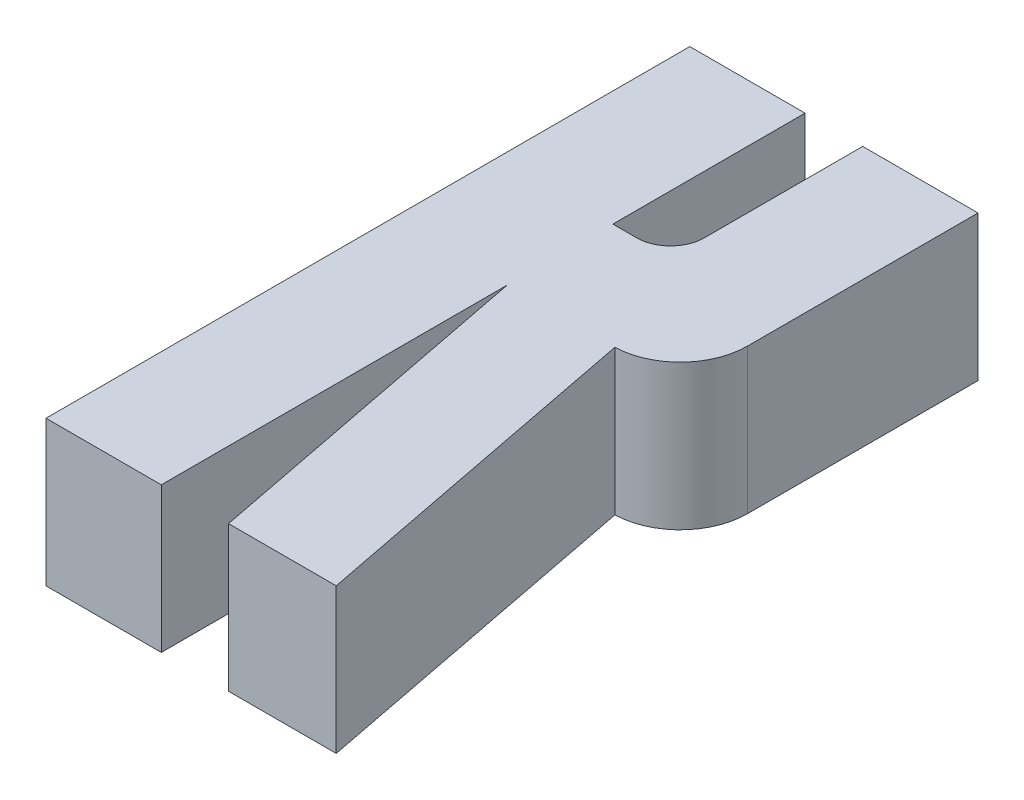
ISO-10303-21;
HEADER;
FILE_DESCRIPTION(('STEP AP214'),'2;1');
FILE_NAME('part.step','',(''),(''),'','','');
FILE_SCHEMA(('AUTOMOTIVE_DESIGN { 1 0 10303 214 1 1 1 1 }'));
ENDSEC;
DATA;
#1=APPLICATION_CONTEXT('core data for automotive mechanical design processes');
#2=APPLICATION_PROTOCOL_DEFINITION('international standard','automotive_design',2000,#1);
#3=PRODUCT_CONTEXT('',#1,'mechanical');
#4=PRODUCT('Part','Part','',(#3));
#5=PRODUCT_RELATED_PRODUCT_CATEGORY('part','',(#4));
#6=PRODUCT_DEFINITION_FORMATION('','',#4);
#7=PRODUCT_DEFINITION_CONTEXT('part definition',#1,'design');
#8=PRODUCT_DEFINITION('design','',#6,#7);
#9=PRODUCT_DEFINITION_SHAPE('','',#8);
#10=(LENGTH_UNIT() NAMED_UNIT(*) SI_UNIT(.MILLI.,.METRE.));
#11=(NAMED_UNIT(*) PLANE_ANGLE_UNIT() SI_UNIT($,.RADIAN.));
#12=(NAMED_UNIT(*) SI_UNIT($,.STERADIAN.) SOLID_ANGLE_UNIT());
#13=UNCERTAINTY_MEASURE_WITH_UNIT(LENGTH_MEASURE(1.E-05),#10,'distance_accuracy_value','');
#14=(GEOMETRIC_REPRESENTATION_CONTEXT(3) GLOBAL_UNCERTAINTY_ASSIGNED_CONTEXT((#13)) GLOBAL_UNIT_ASSIGNED_CONTEXT((#10,
#11,#12)) REPRESENTATION_CONTEXT('',''));
#15=CARTESIAN_POINT('',(0.,0.,0.));
#16=DIRECTION('',(0.,0.,1.));
#17=DIRECTION('',(1.,0.,0.));
#18=AXIS2_PLACEMENT_3D('',#15,#16,#17);
#19=CARTESIAN_POINT('',(1726.18487269122,-302.250162855083,2545.6184611197));
#20=DIRECTION('',(0.,-1.,0.));
#21=DIRECTION('',(0.,0.,-1.));
#22=AXIS2_PLACEMENT_3D('',#19,#20,#21);
#23=PLANE('',#22);
#24=DIRECTION('',(0.,0.,1.));
#25=VECTOR('',#24,1.);
#26=CARTESIAN_POINT('',(1690.03612397511,-302.250162855083,2507.8980276768));
#27=LINE('',#26,#25);
#28=CARTESIAN_POINT('',(1690.03612397511,-302.250162855083,2507.8980276768));
#29=VERTEX_POINT('',#28);
#30=CARTESIAN_POINT('',(1690.03612397511,-302.250162855083,2613.20090437155));
#31=VERTEX_POINT('',#30);
#32=EDGE_CURVE('E11',#29,#31,#27,.T.);
#33=ORIENTED_EDGE('',*,*,#32,.F.);
#34=DIRECTION('',(1.,0.,0.));
#35=VECTOR('',#34,1.);
#36=CARTESIAN_POINT('',(1690.03612397511,-302.250162855083,2507.8980276768));
#37=LINE('',#36,#35);
#38=CARTESIAN_POINT('',(1708.89634069656,-302.250162855083,2507.8980276768));
#39=VERTEX_POINT('',#38);
#40=EDGE_CURVE('E210',#29,#39,#37,.T.);
#41=ORIENTED_EDGE('',*,*,#40,.T.);
#42=DIRECTION('',(0.,0.,-1.));
#43=VECTOR('',#42,1.);
#44=CARTESIAN_POINT('',(1708.89634069656,-302.250162855083,2539.33172221255));
#45=LINE('',#44,#43);
#46=CARTESIAN_POINT('',(1708.89634069656,-302.250162855083,2539.33172221255));
#47=VERTEX_POINT('',#46);
#48=EDGE_CURVE('E126',#47,#39,#45,.T.);
#49=ORIENTED_EDGE('',*,*,#48,.F.);
#50=DIRECTION('',(1.,0.,0.));
#51=VECTOR('',#50,1.);
#52=CARTESIAN_POINT('',(1708.89634069656,-302.250162855083,2539.33172221255));
#53=LINE('',#52,#51);
#54=CARTESIAN_POINT('',(1712.82555251353,-302.250162855083,2539.33172221255));
#55=VERTEX_POINT('',#54);
#56=EDGE_CURVE('E213',#47,#55,#53,.T.);
#57=ORIENTED_EDGE('',*,*,#56,.T.);
#58=CARTESIAN_POINT('',(1712.82555251353,-302.250162855083,2533.83082566879));
#59=DIRECTION('',(0.,-1.,0.));
#60=DIRECTION('',(1.,0.,0.));
#61=AXIS2_PLACEMENT_3D('',#58,#59,#60);
#62=CIRCLE('',#61,5.50089654375593);
#63=CARTESIAN_POINT('',(1718.32644905729,-302.250162855083,2533.83082566879));
#64=VERTEX_POINT('',#63);
#65=EDGE_CURVE('E122',#64,#55,#62,.T.);
#66=ORIENTED_EDGE('',*,*,#65,.F.);
#67=DIRECTION('',(0.,0.,-1.));
#68=VECTOR('',#67,1.);
#69=CARTESIAN_POINT('',(1718.32644905729,-302.250162855083,2533.83082566879));
#70=LINE('',#69,#68);
#71=CARTESIAN_POINT('',(1718.32644905729,-302.250162855083,2507.8980276768));
#72=VERTEX_POINT('',#71);
#73=EDGE_CURVE('E219',#64,#72,#70,.T.);
#74=ORIENTED_EDGE('',*,*,#73,.T.);
#75=DIRECTION('',(1.,0.,0.));
#76=VECTOR('',#75,1.);
#77=CARTESIAN_POINT('',(1718.32644905729,-302.250162855083,2507.8980276768));
#78=LINE('',#77,#76);
#79=CARTESIAN_POINT('',(1737.18666577874,-302.250162855083,2507.8980276768));
#80=VERTEX_POINT('',#79);
#81=EDGE_CURVE('E144',#72,#80,#78,.T.);
#82=ORIENTED_EDGE('',*,*,#81,.T.);
#83=DIRECTION('',(0.,0.,-1.));
#84=VECTOR('',#83,1.);
#85=CARTESIAN_POINT('',(1737.18666577874,-302.250162855083,2545.6184611197));
#86=LINE('',#85,#84);
#87=CARTESIAN_POINT('',(1737.18666577874,-302.250162855083,2545.6184611197));
#88=VERTEX_POINT('',#87);
#89=EDGE_CURVE('E115',#88,#80,#86,.T.);
#90=ORIENTED_EDGE('',*,*,#89,.F.);
#91=CARTESIAN_POINT('',(1726.18487269122,-302.250162855083,2545.6184611197));
#92=DIRECTION('',(0.,-1.,0.));
#93=DIRECTION('',(1.,0.,0.));
#94=AXIS2_PLACEMENT_3D('',#91,#92,#93);
#95=CIRCLE('',#94,11.0017930875118);
#96=CARTESIAN_POINT('',(1726.50753694261,-302.250162855083,2556.61552158699));
#97=VERTEX_POINT('',#96);
#98=EDGE_CURVE('E140',#88,#97,#95,.T.);
#99=ORIENTED_EDGE('',*,*,#98,.T.);
#100=DIRECTION('',(0.190808995376545,0.,0.981627183447664));
#101=VECTOR('',#100,1.);
#102=CARTESIAN_POINT('',(1726.50753694261,-302.250162855083,2556.61552158699));
#103=LINE('',#102,#101);
#104=CARTESIAN_POINT('',(1737.50662114095,-302.250162855083,2613.20090437155));
#105=VERTEX_POINT('',#104);
#106=EDGE_CURVE('E134',#97,#105,#103,.T.);
#107=ORIENTED_EDGE('',*,*,#106,.T.);
#108=DIRECTION('',(1.,0.,0.));
#109=VECTOR('',#108,1.);
#110=CARTESIAN_POINT('',(1719.89450496672,-302.250162855083,2613.20090437155));
#111=LINE('',#110,#109);
#112=CARTESIAN_POINT('',(1719.89450496672,-302.250162855083,2613.20090437155));
#113=VERTEX_POINT('',#112);
#114=EDGE_CURVE('E108',#113,#105,#111,.T.);
#115=ORIENTED_EDGE('',*,*,#114,.F.);
#116=DIRECTION('',(0.190808995376545,0.,0.981627183447664));
#117=VECTOR('',#116,1.);
#118=CARTESIAN_POINT('',(1708.89634069656,-302.250162855083,2556.62025420721));
#119=LINE('',#118,#117);
#120=CARTESIAN_POINT('',(1708.89634069656,-302.250162855083,2556.62025420721));
#121=VERTEX_POINT('',#120);
#122=EDGE_CURVE('E89',#121,#113,#119,.T.);
#123=ORIENTED_EDGE('',*,*,#122,.F.);
#124=DIRECTION('',(0.,0.,-1.));
#125=VECTOR('',#124,1.);
#126=CARTESIAN_POINT('',(1708.89634069656,-302.250162855083,2613.20090437155));
#127=LINE('',#126,#125);
#128=CARTESIAN_POINT('',(1708.89634069656,-302.250162855083,2613.20090437155));
#129=VERTEX_POINT('',#128);
#130=EDGE_CURVE('E81',#129,#121,#127,.T.);
#131=ORIENTED_EDGE('',*,*,#130,.F.);
#132=DIRECTION('',(1.,0.,0.));
#133=VECTOR('',#132,1.);
#134=CARTESIAN_POINT('',(1690.03612397511,-302.250162855083,2613.20090437155));
#135=LINE('',#134,#133);
#136=EDGE_CURVE('E92',#31,#129,#135,.T.);
#137=ORIENTED_EDGE('',*,*,#136,.F.);
#138=EDGE_LOOP('',(#33,#41,#49,#57,#66,#74,#82,#90,#99,#107,#115,#123,#131,#137));
#139=FACE_BOUND('',#138,.T.);
#140=ADVANCED_FACE('F16',(#139),#23,.T.);
#141=CARTESIAN_POINT('',(1690.03612397511,-282.250162855083,2507.8980276768));
#142=DIRECTION('',(0.,0.,-1.));
#143=DIRECTION('',(-1.,0.,0.));
#144=AXIS2_PLACEMENT_3D('',#141,#142,#143);
#145=PLANE('',#144);
#146=DIRECTION('',(0.,-1.,0.));
#147=VECTOR('',#146,1.);
#148=CARTESIAN_POINT('',(1690.03612397511,-282.250162855083,2507.8980276768));
#149=LINE('',#148,#147);
#150=CARTESIAN_POINT('',(1690.03612397511,-278.499891429945,2507.8980276768));
#151=VERTEX_POINT('',#150);
#152=EDGE_CURVE('E25',#151,#29,#149,.T.);
#153=ORIENTED_EDGE('',*,*,#152,.F.);
#154=DIRECTION('',(1.,0.,0.));
#155=VECTOR('',#154,1.);
#156=CARTESIAN_POINT('',(1690.03612397511,-278.499891429945,2507.8980276768));
#157=LINE('',#156,#155);
#158=CARTESIAN_POINT('',(1708.89634069656,-278.499891429945,2507.8980276768));
#159=VERTEX_POINT('',#158);
#160=EDGE_CURVE('E239',#151,#159,#157,.T.);
#161=ORIENTED_EDGE('',*,*,#160,.T.);
#162=DIRECTION('',(0.,-1.,0.));
#163=VECTOR('',#162,1.);
#164=CARTESIAN_POINT('',(1708.89634069656,-282.250162855083,2507.8980276768));
#165=LINE('',#164,#163);
#166=EDGE_CURVE('E19',#159,#39,#165,.T.);
#167=ORIENTED_EDGE('',*,*,#166,.T.);
#168=ORIENTED_EDGE('',*,*,#40,.F.);
#169=EDGE_LOOP('',(#153,#161,#167,#168));
#170=FACE_BOUND('',#169,.T.);
#171=ADVANCED_FACE('F263',(#170),#145,.T.);
#172=CARTESIAN_POINT('',(1708.89634069656,-282.250162855083,2539.33172221255));
#173=DIRECTION('',(-1.,0.,0.));
#174=DIRECTION('',(0.,0.,1.));
#175=AXIS2_PLACEMENT_3D('',#172,#173,#174);
#176=PLANE('',#175);
#177=ORIENTED_EDGE('',*,*,#166,.F.);
#178=DIRECTION('',(0.,0.,1.));
#179=VECTOR('',#178,1.);
#180=CARTESIAN_POINT('',(1708.89634069656,-278.499891429945,2507.8980276768));
#181=LINE('',#180,#179);
#182=CARTESIAN_POINT('',(1708.89634069656,-278.499891429945,2539.33172221255));
#183=VERTEX_POINT('',#182);
#184=EDGE_CURVE('E237',#159,#183,#181,.T.);
#185=ORIENTED_EDGE('',*,*,#184,.T.);
#186=DIRECTION('',(0.,-1.,0.));
#187=VECTOR('',#186,1.);
#188=CARTESIAN_POINT('',(1708.89634069656,-282.250162855083,2539.33172221255));
#189=LINE('',#188,#187);
#190=EDGE_CURVE('E127',#183,#47,#189,.T.);
#191=ORIENTED_EDGE('',*,*,#190,.T.);
#192=ORIENTED_EDGE('',*,*,#48,.T.);
#193=EDGE_LOOP('',(#177,#185,#191,#192));
#194=FACE_BOUND('',#193,.T.);
#195=ADVANCED_FACE('F265',(#194),#176,.F.);
#196=CARTESIAN_POINT('',(1708.89634069656,-282.250162855083,2539.33172221255));
#197=DIRECTION('',(0.,0.,-1.));
#198=DIRECTION('',(-1.,0.,0.));
#199=AXIS2_PLACEMENT_3D('',#196,#197,#198);
#200=PLANE('',#199);
#201=ORIENTED_EDGE('',*,*,#190,.F.);
#202=DIRECTION('',(1.,0.,0.));
#203=VECTOR('',#202,1.);
#204=CARTESIAN_POINT('',(1708.89634069656,-278.499891429945,2539.33172221255));
#205=LINE('',#204,#203);
#206=CARTESIAN_POINT('',(1712.82555251353,-278.499891429945,2539.33172221255));
#207=VERTEX_POINT('',#206);
#208=EDGE_CURVE('E232',#183,#207,#205,.T.);
#209=ORIENTED_EDGE('',*,*,#208,.T.);
#210=DIRECTION('',(0.,-1.,0.));
#211=VECTOR('',#210,1.);
#212=CARTESIAN_POINT('',(1712.82555251353,-282.250162855083,2539.33172221255));
#213=LINE('',#212,#211);
#214=EDGE_CURVE('E125',#207,#55,#213,.T.);
#215=ORIENTED_EDGE('',*,*,#214,.T.);
#216=ORIENTED_EDGE('',*,*,#56,.F.);
#217=EDGE_LOOP('',(#201,#209,#215,#216));
#218=FACE_BOUND('',#217,.T.);
#219=ADVANCED_FACE('F268',(#218),#200,.T.);
#220=CARTESIAN_POINT('',(1712.82555251353,-282.250162855083,2533.83082566879));
#221=DIRECTION('',(0.,-1.,0.));
#222=DIRECTION('',(0.,0.,-1.));
#223=AXIS2_PLACEMENT_3D('',#220,#221,#222);
#224=CYLINDRICAL_SURFACE('',#223,5.50089654375593);
#225=ORIENTED_EDGE('',*,*,#214,.F.);
#226=CARTESIAN_POINT('',(1712.82555251353,-278.499891429953,2533.83082566879));
#227=DIRECTION('',(0.,1.,0.));
#228=DIRECTION('',(0.,0.,-1.));
#229=AXIS2_PLACEMENT_3D('',#226,#227,#228);
#230=CIRCLE('',#229,5.50089654375593);
#231=CARTESIAN_POINT('',(1718.32644905729,-278.499891429953,2533.83082566879));
#232=VERTEX_POINT('',#231);
#233=EDGE_CURVE('E231',#207,#232,#230,.T.);
#234=ORIENTED_EDGE('',*,*,#233,.T.);
#235=DIRECTION('',(0.,-1.,0.));
#236=VECTOR('',#235,1.);
#237=CARTESIAN_POINT('',(1718.32644905729,-282.250162855083,2533.83082566879));
#238=LINE('',#237,#236);
#239=EDGE_CURVE('E123',#232,#64,#238,.T.);
#240=ORIENTED_EDGE('',*,*,#239,.T.);
#241=ORIENTED_EDGE('',*,*,#65,.T.);
#242=EDGE_LOOP('',(#225,#234,#240,#241));
#243=FACE_BOUND('',#242,.T.);
#244=ADVANCED_FACE('F270',(#243),#224,.F.);
#245=CARTESIAN_POINT('',(1718.32644905729,-282.250162855083,2533.83082566879));
#246=DIRECTION('',(-1.,0.,0.));
#247=DIRECTION('',(0.,0.,1.));
#248=AXIS2_PLACEMENT_3D('',#245,#246,#247);
#249=PLANE('',#248);
#250=ORIENTED_EDGE('',*,*,#239,.F.);
#251=DIRECTION('',(0.,0.,-1.));
#252=VECTOR('',#251,1.);
#253=CARTESIAN_POINT('',(1718.32644905729,-278.499891429945,2533.83082566879));
#254=LINE('',#253,#252);
#255=CARTESIAN_POINT('',(1718.32644905729,-278.499891429945,2507.8980276768));
#256=VERTEX_POINT('',#255);
#257=EDGE_CURVE('E204',#232,#256,#254,.T.);
#258=ORIENTED_EDGE('',*,*,#257,.T.);
#259=DIRECTION('',(0.,-1.,0.));
#260=VECTOR('',#259,1.);
#261=CARTESIAN_POINT('',(1718.32644905729,-282.250162855083,2507.8980276768));
#262=LINE('',#261,#260);
#263=EDGE_CURVE('E120',#256,#72,#262,.T.);
#264=ORIENTED_EDGE('',*,*,#263,.T.);
#265=ORIENTED_EDGE('',*,*,#73,.F.);
#266=EDGE_LOOP('',(#250,#258,#264,#265));
#267=FACE_BOUND('',#266,.T.);
#268=ADVANCED_FACE('F228',(#267),#249,.T.);
#269=CARTESIAN_POINT('',(1718.32644905729,-282.250162855083,2507.8980276768));
#270=DIRECTION('',(0.,0.,-1.));
#271=DIRECTION('',(-1.,0.,0.));
#272=AXIS2_PLACEMENT_3D('',#269,#270,#271);
#273=PLANE('',#272);
#274=ORIENTED_EDGE('',*,*,#263,.F.);
#275=DIRECTION('',(1.,0.,0.));
#276=VECTOR('',#275,1.);
#277=CARTESIAN_POINT('',(1718.32644905729,-278.499891429945,2507.8980276768));
#278=LINE('',#277,#276);
#279=CARTESIAN_POINT('',(1737.18666577874,-278.499891429945,2507.8980276768));
#280=VERTEX_POINT('',#279);
#281=EDGE_CURVE('E200',#256,#280,#278,.T.);
#282=ORIENTED_EDGE('',*,*,#281,.T.);
#283=DIRECTION('',(0.,-1.,0.));
#284=VECTOR('',#283,1.);
#285=CARTESIAN_POINT('',(1737.18666577874,-282.250162855083,2507.8980276768));
#286=LINE('',#285,#284);
#287=EDGE_CURVE('E118',#280,#80,#286,.T.);
#288=ORIENTED_EDGE('',*,*,#287,.T.);
#289=ORIENTED_EDGE('',*,*,#81,.F.);
#290=EDGE_LOOP('',(#274,#282,#288,#289));
#291=FACE_BOUND('',#290,.T.);
#292=ADVANCED_FACE('F201',(#291),#273,.T.);
#293=CARTESIAN_POINT('',(1737.18666577874,-282.250162855083,2545.6184611197));
#294=DIRECTION('',(-1.,0.,0.));
#295=DIRECTION('',(0.,0.,1.));
#296=AXIS2_PLACEMENT_3D('',#293,#294,#295);
#297=PLANE('',#296);
#298=ORIENTED_EDGE('',*,*,#287,.F.);
#299=DIRECTION('',(0.,0.,1.));
#300=VECTOR('',#299,1.);
#301=CARTESIAN_POINT('',(1737.18666577874,-278.499891429945,2507.8980276768));
#302=LINE('',#301,#300);
#303=CARTESIAN_POINT('',(1737.18666577874,-278.499891429945,2545.6184611197));
#304=VERTEX_POINT('',#303);
#305=EDGE_CURVE('E195',#280,#304,#302,.T.);
#306=ORIENTED_EDGE('',*,*,#305,.T.);
#307=DIRECTION('',(0.,-1.,0.));
#308=VECTOR('',#307,1.);
#309=CARTESIAN_POINT('',(1737.18666577874,-282.250162855083,2545.6184611197));
#310=LINE('',#309,#308);
#311=EDGE_CURVE('E116',#304,#88,#310,.T.);
#312=ORIENTED_EDGE('',*,*,#311,.T.);
#313=ORIENTED_EDGE('',*,*,#89,.T.);
#314=EDGE_LOOP('',(#298,#306,#312,#313));
#315=FACE_BOUND('',#314,.T.);
#316=ADVANCED_FACE('F192',(#315),#297,.F.);
#317=CARTESIAN_POINT('',(1726.18487269122,-282.250162855083,2545.6184611197));
#318=DIRECTION('',(0.,-1.,0.));
#319=DIRECTION('',(0.,0.,-1.));
#320=AXIS2_PLACEMENT_3D('',#317,#318,#319);
#321=CYLINDRICAL_SURFACE('',#320,11.0017930875118);
#322=ORIENTED_EDGE('',*,*,#311,.F.);
#323=CARTESIAN_POINT('',(1726.18487269122,-278.499891429945,2545.6184611197));
#324=DIRECTION('',(0.,-1.,0.));
#325=DIRECTION('',(0.,0.,-1.));
#326=AXIS2_PLACEMENT_3D('',#323,#324,#325);
#327=CIRCLE('',#326,11.0017930875118);
#328=CARTESIAN_POINT('',(1726.50753694261,-278.499891429945,2556.61552158699));
#329=VERTEX_POINT('',#328);
#330=EDGE_CURVE('E209',#304,#329,#327,.T.);
#331=ORIENTED_EDGE('',*,*,#330,.T.);
#332=DIRECTION('',(0.,-1.,0.));
#333=VECTOR('',#332,1.);
#334=CARTESIAN_POINT('',(1726.50753694261,-282.250162855083,2556.61552158699));
#335=LINE('',#334,#333);
#336=EDGE_CURVE('E113',#329,#97,#335,.T.);
#337=ORIENTED_EDGE('',*,*,#336,.T.);
#338=ORIENTED_EDGE('',*,*,#98,.F.);
#339=EDGE_LOOP('',(#322,#331,#337,#338));
#340=FACE_BOUND('',#339,.T.);
#341=ADVANCED_FACE('F253',(#340),#321,.T.);
#342=CARTESIAN_POINT('',(1726.50753694261,-282.250162855083,2556.61552158699));
#343=DIRECTION('',(0.981627183447664,0.,-0.190808995376545));
#344=DIRECTION('',(-0.190808995376545,0.,-0.981627183447664));
#345=AXIS2_PLACEMENT_3D('',#342,#343,#344);
#346=PLANE('',#345);
#347=ORIENTED_EDGE('',*,*,#336,.F.);
#348=DIRECTION('',(0.190808995376548,0.,0.981627183447663));
#349=VECTOR('',#348,1.);
#350=CARTESIAN_POINT('',(1726.50753694261,-278.499891429945,2556.61552158699));
#351=LINE('',#350,#349);
#352=CARTESIAN_POINT('',(1737.50662114095,-278.499891429946,2613.20090437155));
#353=VERTEX_POINT('',#352);
#354=EDGE_CURVE('E248',#329,#353,#351,.T.);
#355=ORIENTED_EDGE('',*,*,#354,.T.);
#356=DIRECTION('',(0.,-1.,0.));
#357=VECTOR('',#356,1.);
#358=CARTESIAN_POINT('',(1737.50662114095,-282.250162855083,2613.20090437155));
#359=LINE('',#358,#357);
#360=EDGE_CURVE('E111',#353,#105,#359,.T.);
#361=ORIENTED_EDGE('',*,*,#360,.T.);
#362=ORIENTED_EDGE('',*,*,#106,.F.);
#363=EDGE_LOOP('',(#347,#355,#361,#362));
#364=FACE_BOUND('',#363,.T.);
#365=ADVANCED_FACE('F258',(#364),#346,.T.);
#366=CARTESIAN_POINT('',(1719.89450496672,-282.250162855083,2613.20090437155));
#367=DIRECTION('',(0.,0.,-1.));
#368=DIRECTION('',(-1.,0.,0.));
#369=AXIS2_PLACEMENT_3D('',#366,#367,#368);
#370=PLANE('',#369);
#371=ORIENTED_EDGE('',*,*,#360,.F.);
#372=DIRECTION('',(-1.,0.,0.));
#373=VECTOR('',#372,1.);
#374=CARTESIAN_POINT('',(1737.50662114095,-278.499891429946,2613.20090437155));
#375=LINE('',#374,#373);
#376=CARTESIAN_POINT('',(1719.89450496672,-278.499891429946,2613.20090437155));
#377=VERTEX_POINT('',#376);
#378=EDGE_CURVE('E157',#353,#377,#375,.T.);
#379=ORIENTED_EDGE('',*,*,#378,.T.);
#380=DIRECTION('',(0.,-1.,0.));
#381=VECTOR('',#380,1.);
#382=CARTESIAN_POINT('',(1719.89450496672,-282.250162855083,2613.20090437155));
#383=LINE('',#382,#381);
#384=EDGE_CURVE('E109',#377,#113,#383,.T.);
#385=ORIENTED_EDGE('',*,*,#384,.T.);
#386=ORIENTED_EDGE('',*,*,#114,.T.);
#387=EDGE_LOOP('',(#371,#379,#385,#386));
#388=FACE_BOUND('',#387,.T.);
#389=ADVANCED_FACE('F150',(#388),#370,.F.);
#390=CARTESIAN_POINT('',(1708.89634069656,-282.250162855083,2556.62025420721));
#391=DIRECTION('',(0.981627183447664,0.,-0.190808995376545));
#392=DIRECTION('',(-0.190808995376545,0.,-0.981627183447664));
#393=AXIS2_PLACEMENT_3D('',#390,#391,#392);
#394=PLANE('',#393);
#395=ORIENTED_EDGE('',*,*,#384,.F.);
#396=DIRECTION('',(-0.190808995376545,0.,-0.981627183447664));
#397=VECTOR('',#396,1.);
#398=CARTESIAN_POINT('',(1719.89450496672,-278.499891429946,2613.20090437155));
#399=LINE('',#398,#397);
#400=CARTESIAN_POINT('',(1708.89634069656,-278.499891429945,2556.62025420721));
#401=VERTEX_POINT('',#400);
#402=EDGE_CURVE('E163',#377,#401,#399,.T.);
#403=ORIENTED_EDGE('',*,*,#402,.T.);
#404=DIRECTION('',(0.,-1.,0.));
#405=VECTOR('',#404,1.);
#406=CARTESIAN_POINT('',(1708.89634069656,-282.250162855083,2556.62025420721));
#407=LINE('',#406,#405);
#408=EDGE_CURVE('E106',#401,#121,#407,.T.);
#409=ORIENTED_EDGE('',*,*,#408,.T.);
#410=ORIENTED_EDGE('',*,*,#122,.T.);
#411=EDGE_LOOP('',(#395,#403,#409,#410));
#412=FACE_BOUND('',#411,.T.);
#413=ADVANCED_FACE('F161',(#412),#394,.F.);
#414=CARTESIAN_POINT('',(1708.89634069656,-282.250162855083,2613.20090437155));
#415=DIRECTION('',(-1.,0.,0.));
#416=DIRECTION('',(0.,0.,1.));
#417=AXIS2_PLACEMENT_3D('',#414,#415,#416);
#418=PLANE('',#417);
#419=ORIENTED_EDGE('',*,*,#408,.F.);
#420=DIRECTION('',(0.,0.,1.));
#421=VECTOR('',#420,1.);
#422=CARTESIAN_POINT('',(1708.89634069656,-278.499891429946,2556.62025420721));
#423=LINE('',#422,#421);
#424=CARTESIAN_POINT('',(1708.89634069656,-278.499891429946,2613.20090437155));
#425=VERTEX_POINT('',#424);
#426=EDGE_CURVE('E85',#401,#425,#423,.T.);
#427=ORIENTED_EDGE('',*,*,#426,.T.);
#428=DIRECTION('',(0.,-1.,0.));
#429=VECTOR('',#428,1.);
#430=CARTESIAN_POINT('',(1708.89634069656,-282.250162855083,2613.20090437155));
#431=LINE('',#430,#429);
#432=EDGE_CURVE('E76',#425,#129,#431,.T.);
#433=ORIENTED_EDGE('',*,*,#432,.T.);
#434=ORIENTED_EDGE('',*,*,#130,.T.);
#435=EDGE_LOOP('',(#419,#427,#433,#434));
#436=FACE_BOUND('',#435,.T.);
#437=ADVANCED_FACE('F79',(#436),#418,.F.);
#438=CARTESIAN_POINT('',(1690.03612397511,-282.250162855083,2613.20090437155));
#439=DIRECTION('',(0.,0.,-1.));
#440=DIRECTION('',(-1.,0.,0.));
#441=AXIS2_PLACEMENT_3D('',#438,#439,#440);
#442=PLANE('',#441);
#443=ORIENTED_EDGE('',*,*,#432,.F.);
#444=DIRECTION('',(-1.,0.,0.));
#445=VECTOR('',#444,1.);
#446=CARTESIAN_POINT('',(1708.89634069656,-278.499891429946,2613.20090437155));
#447=LINE('',#446,#445);
#448=CARTESIAN_POINT('',(1690.03612397511,-278.499891429946,2613.20090437155));
#449=VERTEX_POINT('',#448);
#450=EDGE_CURVE('E243',#425,#449,#447,.T.);
#451=ORIENTED_EDGE('',*,*,#450,.T.);
#452=DIRECTION('',(0.,-1.,0.));
#453=VECTOR('',#452,1.);
#454=CARTESIAN_POINT('',(1690.03612397511,-282.250162855083,2613.20090437155));
#455=LINE('',#454,#453);
#456=EDGE_CURVE('E95',#449,#31,#455,.T.);
#457=ORIENTED_EDGE('',*,*,#456,.T.);
#458=ORIENTED_EDGE('',*,*,#136,.T.);
#459=EDGE_LOOP('',(#443,#451,#457,#458));
#460=FACE_BOUND('',#459,.T.);
#461=ADVANCED_FACE('F93',(#460),#442,.F.);
#462=CARTESIAN_POINT('',(1690.03612397511,-282.250162855083,2507.8980276768));
#463=DIRECTION('',(1.,0.,0.));
#464=DIRECTION('',(0.,0.,-1.));
#465=AXIS2_PLACEMENT_3D('',#462,#463,#464);
#466=PLANE('',#465);
#467=ORIENTED_EDGE('',*,*,#456,.F.);
#468=DIRECTION('',(0.,0.,-1.));
#469=VECTOR('',#468,1.);
#470=CARTESIAN_POINT('',(1690.03612397511,-278.499891429945,2613.20090437155));
#471=LINE('',#470,#469);
#472=EDGE_CURVE('E241',#449,#151,#471,.T.);
#473=ORIENTED_EDGE('',*,*,#472,.T.);
#474=ORIENTED_EDGE('',*,*,#152,.T.);
#475=ORIENTED_EDGE('',*,*,#32,.T.);
#476=EDGE_LOOP('',(#467,#473,#474,#475));
#477=FACE_BOUND('',#476,.T.);
#478=ADVANCED_FACE('F262',(#477),#466,.F.);
#479=CARTESIAN_POINT('',(1726.18487269122,-278.499891429945,2545.6184611197));
#480=DIRECTION('',(0.,-1.,0.));
#481=DIRECTION('',(0.,0.,-1.));
#482=AXIS2_PLACEMENT_3D('',#479,#480,#481);
#483=PLANE('',#482);
#484=ORIENTED_EDGE('',*,*,#330,.F.);
#485=ORIENTED_EDGE('',*,*,#305,.F.);
#486=ORIENTED_EDGE('',*,*,#281,.F.);
#487=ORIENTED_EDGE('',*,*,#257,.F.);
#488=ORIENTED_EDGE('',*,*,#233,.F.);
#489=ORIENTED_EDGE('',*,*,#208,.F.);
#490=ORIENTED_EDGE('',*,*,#184,.F.);
#491=ORIENTED_EDGE('',*,*,#160,.F.);
#492=ORIENTED_EDGE('',*,*,#472,.F.);
#493=ORIENTED_EDGE('',*,*,#450,.F.);
#494=ORIENTED_EDGE('',*,*,#426,.F.);
#495=ORIENTED_EDGE('',*,*,#402,.F.);
#496=ORIENTED_EDGE('',*,*,#378,.F.);
#497=ORIENTED_EDGE('',*,*,#354,.F.);
#498=EDGE_LOOP('',(#484,#485,#486,#487,#488,#489,#490,#491,#492,#493,#494,#495,#496,#497));
#499=FACE_BOUND('',#498,.T.);
#500=ADVANCED_FACE('F206',(#499),#483,.F.);
#501=CLOSED_SHELL('',(#140,#171,#195,#219,#244,#268,#292,#316,#341,#365,#389,#413,#437,#461,
#478,#500));
#502=MANIFOLD_SOLID_BREP('B1',#501);
#503=ADVANCED_BREP_SHAPE_REPRESENTATION('',(#18,#502),#14);
#504=SHAPE_DEFINITION_REPRESENTATION(#9,#503);
ENDSEC;
END-ISO-10303-21;
